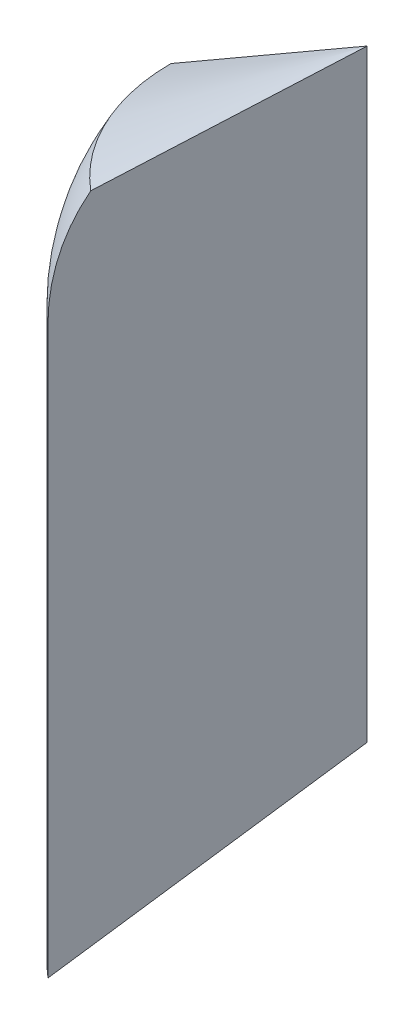
ISO-10303-21;
HEADER;
FILE_DESCRIPTION(('STEP AP214'),'2;1');
FILE_NAME('part.step','',(''),(''),'','','');
FILE_SCHEMA(('AUTOMOTIVE_DESIGN { 1 0 10303 214 1 1 1 1 }'));
ENDSEC;
DATA;
#1=APPLICATION_CONTEXT('core data for automotive mechanical design processes');
#2=APPLICATION_PROTOCOL_DEFINITION('international standard','automotive_design',2000,#1);
#3=PRODUCT_CONTEXT('',#1,'mechanical');
#4=PRODUCT('Part','Part','',(#3));
#5=PRODUCT_RELATED_PRODUCT_CATEGORY('part','',(#4));
#6=PRODUCT_DEFINITION_FORMATION('','',#4);
#7=PRODUCT_DEFINITION_CONTEXT('part definition',#1,'design');
#8=PRODUCT_DEFINITION('design','',#6,#7);
#9=PRODUCT_DEFINITION_SHAPE('','',#8);
#10=(LENGTH_UNIT() NAMED_UNIT(*) SI_UNIT(.MILLI.,.METRE.));
#11=(NAMED_UNIT(*) PLANE_ANGLE_UNIT() SI_UNIT($,.RADIAN.));
#12=(NAMED_UNIT(*) SI_UNIT($,.STERADIAN.) SOLID_ANGLE_UNIT());
#13=UNCERTAINTY_MEASURE_WITH_UNIT(LENGTH_MEASURE(1.E-05),#10,'distance_accuracy_value','');
#14=(GEOMETRIC_REPRESENTATION_CONTEXT(3) GLOBAL_UNCERTAINTY_ASSIGNED_CONTEXT((#13)) GLOBAL_UNIT_ASSIGNED_CONTEXT((#10,
#11,#12)) REPRESENTATION_CONTEXT('',''));
#15=CARTESIAN_POINT('',(0.,0.,0.));
#16=DIRECTION('',(0.,0.,1.));
#17=DIRECTION('',(1.,0.,0.));
#18=AXIS2_PLACEMENT_3D('',#15,#16,#17);
#19=CARTESIAN_POINT('',(0.,0.,0.));
#20=DIRECTION('',(0.,-1.,0.));
#21=DIRECTION('',(0.,0.,-1.));
#22=AXIS2_PLACEMENT_3D('',#19,#20,#21);
#23=CYLINDRICAL_SURFACE('',#22,30480.);
#24=CARTESIAN_POINT('',(0.,76200.,0.));
#25=DIRECTION('',(0.,-1.,0.));
#26=DIRECTION('',(0.,0.,-1.));
#27=AXIS2_PLACEMENT_3D('',#24,#25,#26);
#28=CIRCLE('',#27,30480.);
#29=CARTESIAN_POINT('',(-19592.1663432457,76200.,23349.0346262665));
#30=VERTEX_POINT('',#29);
#31=CARTESIAN_POINT('',(-30480.,76200.,0.));
#32=VERTEX_POINT('',#31);
#33=EDGE_CURVE('E11',#30,#32,#28,.T.);
#34=ORIENTED_EDGE('',*,*,#33,.T.);
#35=DIRECTION('',(0.,1.,0.));
#36=VECTOR('',#35,1.);
#37=CARTESIAN_POINT('',(-30480.,-3.73272344380113E-12,0.));
#38=LINE('',#37,#36);
#39=CARTESIAN_POINT('',(-30480.,-3.73272344380113E-12,0.));
#40=VERTEX_POINT('',#39);
#41=EDGE_CURVE('E77',#40,#32,#38,.T.);
#42=ORIENTED_EDGE('',*,*,#41,.F.);
#43=CARTESIAN_POINT('',(0.,-3.73272344380113E-12,0.));
#44=DIRECTION('',(0.,-1.,0.));
#45=DIRECTION('',(0.,0.,-1.));
#46=AXIS2_PLACEMENT_3D('',#43,#44,#45);
#47=CIRCLE('',#46,30480.);
#48=CARTESIAN_POINT('',(-19592.1663432457,-3.73272344380113E-12,23349.0346262665));
#49=VERTEX_POINT('',#48);
#50=EDGE_CURVE('E52',#49,#40,#47,.T.);
#51=ORIENTED_EDGE('',*,*,#50,.F.);
#52=DIRECTION('',(0.,1.,0.));
#53=VECTOR('',#52,1.);
#54=CARTESIAN_POINT('',(-19592.1663432457,-3.73272344380113E-12,23349.0346262665));
#55=LINE('',#54,#53);
#56=EDGE_CURVE('E78',#49,#30,#55,.T.);
#57=ORIENTED_EDGE('',*,*,#56,.T.);
#58=EDGE_LOOP('',(#34,#42,#51,#57));
#59=FACE_BOUND('',#58,.T.);
#60=ADVANCED_FACE('F37',(#59),#23,.T.);
#61=CARTESIAN_POINT('',(0.,76200.,0.));
#62=DIRECTION('',(0.,-1.,0.));
#63=DIRECTION('',(-0.642787609686538,0.,0.766044443118979));
#64=AXIS2_PLACEMENT_3D('',#61,#62,#63);
#65=SPHERICAL_SURFACE('',#64,30480.);
#66=CARTESIAN_POINT('',(0.,91439.9999999999,0.));
#67=DIRECTION('',(0.,-1.,0.));
#68=DIRECTION('',(0.,0.,-1.));
#69=AXIS2_PLACEMENT_3D('',#66,#67,#68);
#70=CIRCLE('',#69,26396.4543073497);
#71=CARTESIAN_POINT('',(-16967.3137684213,91439.9999999999,20220.8571401893));
#72=VERTEX_POINT('',#71);
#73=CARTESIAN_POINT('',(-26396.4543073497,91439.9999999999,0.));
#74=VERTEX_POINT('',#73);
#75=EDGE_CURVE('E45',#72,#74,#70,.T.);
#76=ORIENTED_EDGE('',*,*,#75,.T.);
#77=CARTESIAN_POINT('',(0.,76200.,0.));
#78=DIRECTION('',(0.,0.,-1.));
#79=DIRECTION('',(-1.,0.,0.));
#80=AXIS2_PLACEMENT_3D('',#77,#78,#79);
#81=CIRCLE('',#80,30480.);
#82=EDGE_CURVE('E87',#32,#74,#81,.T.);
#83=ORIENTED_EDGE('',*,*,#82,.F.);
#84=ORIENTED_EDGE('',*,*,#33,.F.);
#85=CARTESIAN_POINT('',(0.,76200.,0.));
#86=DIRECTION('',(-0.766044443118979,0.,-0.642787609686538));
#87=DIRECTION('',(-0.642787609686538,0.,0.766044443118979));
#88=AXIS2_PLACEMENT_3D('',#85,#86,#87);
#89=CIRCLE('',#88,30480.);
#90=EDGE_CURVE('E96',#30,#72,#89,.T.);
#91=ORIENTED_EDGE('',*,*,#90,.T.);
#92=EDGE_LOOP('',(#76,#83,#84,#91));
#93=FACE_BOUND('',#92,.T.);
#94=ADVANCED_FACE('F39',(#93),#65,.T.);
#95=CARTESIAN_POINT('',(0.,106680.,0.));
#96=DIRECTION('',(0.,-1.,0.));
#97=DIRECTION('',(0.,0.,-1.));
#98=AXIS2_PLACEMENT_3D('',#95,#96,#97);
#99=CONICAL_SURFACE('',#98,4.66590430475141E-12,1.0471975511966);
#100=DIRECTION('',(-0.866025403784438,-0.500000000000002,0.));
#101=VECTOR('',#100,1.);
#102=CARTESIAN_POINT('',(-4.66590430475141E-12,106680.,0.));
#103=LINE('',#102,#101);
#104=CARTESIAN_POINT('',(-2.99918547507729E-12,106680.,3.57429006477975E-12));
#105=VERTEX_POINT('',#104);
#106=EDGE_CURVE('E90',#105,#74,#103,.T.);
#107=ORIENTED_EDGE('',*,*,#106,.T.);
#108=ORIENTED_EDGE('',*,*,#75,.F.);
#109=DIRECTION('',(-0.556670399226417,-0.500000000000002,0.663413948168939));
#110=VECTOR('',#109,1.);
#111=CARTESIAN_POINT('',(-2.99918547507729E-12,106680.,3.57429006477975E-12));
#112=LINE('',#111,#110);
#113=EDGE_CURVE('E98',#105,#72,#112,.T.);
#114=ORIENTED_EDGE('',*,*,#113,.F.);
#115=EDGE_LOOP('',(#107,#108,#114));
#116=FACE_BOUND('',#115,.T.);
#117=ADVANCED_FACE('F111',(#116),#99,.T.);
#118=CARTESIAN_POINT('',(0.,25575.7567582836,0.));
#119=DIRECTION('',(0.,-1.,0.));
#120=DIRECTION('',(0.,0.,-1.));
#121=AXIS2_PLACEMENT_3D('',#118,#119,#120);
#122=CONICAL_SURFACE('',#121,1.08593127197962E-12,0.872664625997163);
#123=DIRECTION('',(-0.492403876506102,-0.642787609686541,0.586824088833465));
#124=VECTOR('',#123,1.);
#125=CARTESIAN_POINT('',(6.98023166599641E-13,25575.7567582836,-8.31871616509112E-13));
#126=LINE('',#125,#124);
#127=CARTESIAN_POINT('',(6.98023166599641E-13,25575.7567582836,-8.31871616509112E-13));
#128=VERTEX_POINT('',#127);
#129=EDGE_CURVE('E103',#128,#49,#126,.T.);
#130=ORIENTED_EDGE('',*,*,#129,.T.);
#131=ORIENTED_EDGE('',*,*,#50,.T.);
#132=DIRECTION('',(-0.766044443118977,-0.642787609686541,0.));
#133=VECTOR('',#132,1.);
#134=CARTESIAN_POINT('',(1.08593127197962E-12,25575.7567582836,0.));
#135=LINE('',#134,#133);
#136=EDGE_CURVE('E59',#128,#40,#135,.T.);
#137=ORIENTED_EDGE('',*,*,#136,.F.);
#138=EDGE_LOOP('',(#130,#131,#137));
#139=FACE_BOUND('',#138,.T.);
#140=ADVANCED_FACE('F105',(#139),#122,.F.);
#141=CARTESIAN_POINT('',(0.,76200.,0.));
#142=DIRECTION('',(-0.766044443118979,0.,-0.642787609686538));
#143=DIRECTION('',(-0.642787609686538,0.,0.766044443118979));
#144=AXIS2_PLACEMENT_3D('',#141,#142,#143);
#145=PLANE('',#144);
#146=ORIENTED_EDGE('',*,*,#56,.F.);
#147=ORIENTED_EDGE('',*,*,#129,.F.);
#148=DIRECTION('',(0.,-1.,0.));
#149=VECTOR('',#148,1.);
#150=CARTESIAN_POINT('',(-2.99918547507729E-12,106680.,3.57429006477975E-12));
#151=LINE('',#150,#149);
#152=EDGE_CURVE('E101',#105,#128,#151,.T.);
#153=ORIENTED_EDGE('',*,*,#152,.F.);
#154=ORIENTED_EDGE('',*,*,#113,.T.);
#155=ORIENTED_EDGE('',*,*,#90,.F.);
#156=EDGE_LOOP('',(#146,#147,#153,#154,#155));
#157=FACE_BOUND('',#156,.T.);
#158=ADVANCED_FACE('F108',(#157),#145,.F.);
#159=CARTESIAN_POINT('',(0.,76200.,0.));
#160=DIRECTION('',(0.,0.,-1.));
#161=DIRECTION('',(-1.,0.,0.));
#162=AXIS2_PLACEMENT_3D('',#159,#160,#161);
#163=PLANE('',#162);
#164=ORIENTED_EDGE('',*,*,#41,.T.);
#165=ORIENTED_EDGE('',*,*,#82,.T.);
#166=ORIENTED_EDGE('',*,*,#106,.F.);
#167=ORIENTED_EDGE('',*,*,#152,.T.);
#168=ORIENTED_EDGE('',*,*,#136,.T.);
#169=EDGE_LOOP('',(#164,#165,#166,#167,#168));
#170=FACE_BOUND('',#169,.T.);
#171=ADVANCED_FACE('F85',(#170),#163,.T.);
#172=CLOSED_SHELL('',(#60,#94,#117,#140,#158,#171));
#173=MANIFOLD_SOLID_BREP('B2',#172);
#174=ADVANCED_BREP_SHAPE_REPRESENTATION('',(#18,#173),#14);
#175=SHAPE_DEFINITION_REPRESENTATION(#9,#174);
ENDSEC;
END-ISO-10303-21;
